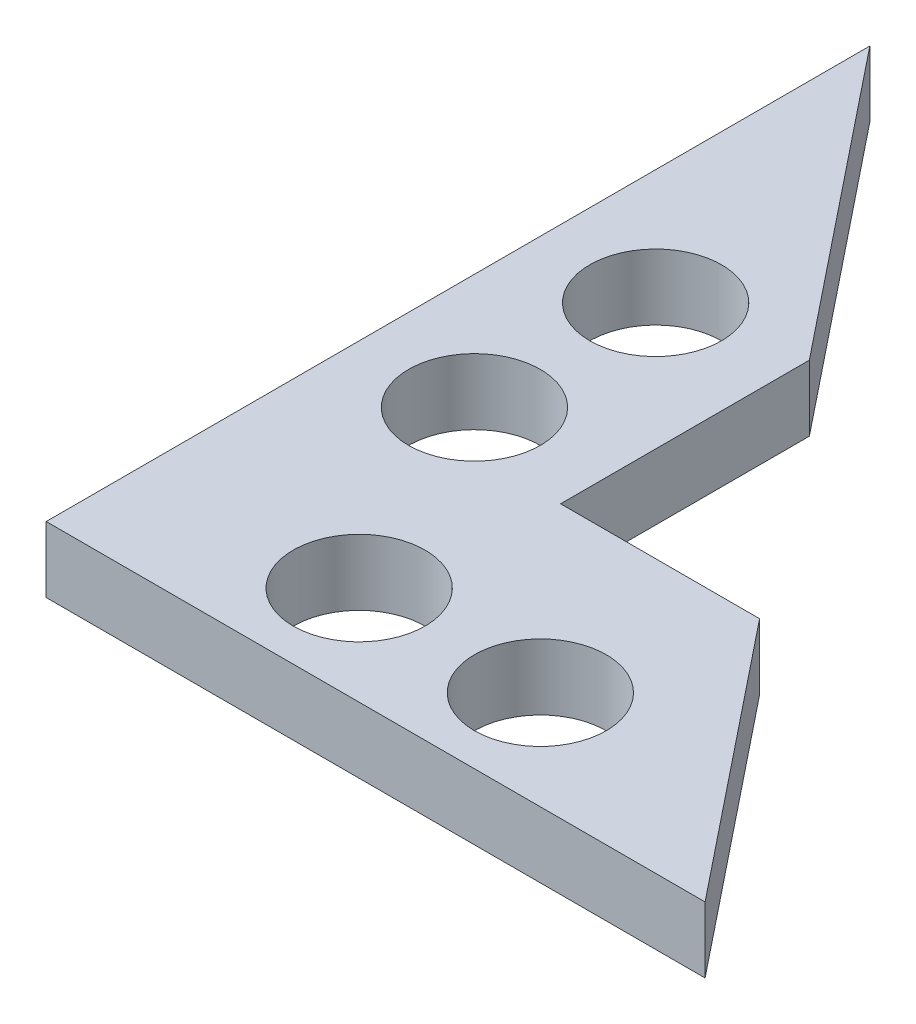
ISO-10303-21;
HEADER;
FILE_DESCRIPTION(('STEP AP214'),'2;1');
FILE_NAME('part.step','',(''),(''),'','','');
FILE_SCHEMA(('AUTOMOTIVE_DESIGN { 1 0 10303 214 1 1 1 1 }'));
ENDSEC;
DATA;
#1=APPLICATION_CONTEXT('core data for automotive mechanical design processes');
#2=APPLICATION_PROTOCOL_DEFINITION('international standard','automotive_design',2000,#1);
#3=PRODUCT_CONTEXT('',#1,'mechanical');
#4=PRODUCT('Part','Part','',(#3));
#5=PRODUCT_RELATED_PRODUCT_CATEGORY('part','',(#4));
#6=PRODUCT_DEFINITION_FORMATION('','',#4);
#7=PRODUCT_DEFINITION_CONTEXT('part definition',#1,'design');
#8=PRODUCT_DEFINITION('design','',#6,#7);
#9=PRODUCT_DEFINITION_SHAPE('','',#8);
#10=(LENGTH_UNIT() NAMED_UNIT(*) SI_UNIT(.MILLI.,.METRE.));
#11=(NAMED_UNIT(*) PLANE_ANGLE_UNIT() SI_UNIT($,.RADIAN.));
#12=(NAMED_UNIT(*) SI_UNIT($,.STERADIAN.) SOLID_ANGLE_UNIT());
#13=UNCERTAINTY_MEASURE_WITH_UNIT(LENGTH_MEASURE(1.E-05),#10,'distance_accuracy_value','');
#14=(GEOMETRIC_REPRESENTATION_CONTEXT(3) GLOBAL_UNCERTAINTY_ASSIGNED_CONTEXT((#13)) GLOBAL_UNIT_ASSIGNED_CONTEXT((#10,
#11,#12)) REPRESENTATION_CONTEXT('',''));
#15=CARTESIAN_POINT('',(0.,0.,0.));
#16=DIRECTION('',(0.,0.,1.));
#17=DIRECTION('',(1.,0.,0.));
#18=AXIS2_PLACEMENT_3D('',#15,#16,#17);
#19=CARTESIAN_POINT('',(0.,5.08,-63.5));
#20=DIRECTION('',(-0.78086880944303,0.,0.624695047554424));
#21=DIRECTION('',(0.624695047554424,0.,0.78086880944303));
#22=AXIS2_PLACEMENT_3D('',#19,#20,#21);
#23=PLANE('',#22);
#24=DIRECTION('',(-0.624695047554424,0.,-0.78086880944303));
#25=VECTOR('',#24,1.);
#26=CARTESIAN_POINT('',(0.,0.,-63.5));
#27=LINE('',#26,#25);
#28=CARTESIAN_POINT('',(50.8,0.,0.));
#29=VERTEX_POINT('',#28);
#30=CARTESIAN_POINT('',(33.9902504946271,0.,-21.0121868817161));
#31=VERTEX_POINT('',#30);
#32=EDGE_CURVE('E103',#29,#31,#27,.T.);
#33=ORIENTED_EDGE('',*,*,#32,.T.);
#34=DIRECTION('',(0.,1.,0.));
#35=VECTOR('',#34,1.);
#36=CARTESIAN_POINT('',(33.9902504946271,-2.54,-21.0121868817161));
#37=LINE('',#36,#35);
#38=CARTESIAN_POINT('',(33.9902504946271,5.08,-21.0121868817161));
#39=VERTEX_POINT('',#38);
#40=EDGE_CURVE('E98',#31,#39,#37,.T.);
#41=ORIENTED_EDGE('',*,*,#40,.T.);
#42=DIRECTION('',(-0.624695047554424,0.,-0.78086880944303));
#43=VECTOR('',#42,1.);
#44=CARTESIAN_POINT('',(0.,5.08,-63.5));
#45=LINE('',#44,#43);
#46=CARTESIAN_POINT('',(50.8,5.08,0.));
#47=VERTEX_POINT('',#46);
#48=EDGE_CURVE('E81',#47,#39,#45,.T.);
#49=ORIENTED_EDGE('',*,*,#48,.F.);
#50=DIRECTION('',(0.,-1.,0.));
#51=VECTOR('',#50,1.);
#52=CARTESIAN_POINT('',(50.8,5.08,0.));
#53=LINE('',#52,#51);
#54=EDGE_CURVE('E128',#47,#29,#53,.T.);
#55=ORIENTED_EDGE('',*,*,#54,.T.);
#56=EDGE_LOOP('',(#33,#41,#49,#55));
#57=FACE_BOUND('',#56,.T.);
#58=ADVANCED_FACE('F33',(#57),#23,.F.);
#59=CARTESIAN_POINT('',(0.,5.08,0.));
#60=DIRECTION('',(0.,0.,-1.));
#61=DIRECTION('',(-1.,0.,0.));
#62=AXIS2_PLACEMENT_3D('',#59,#60,#61);
#63=PLANE('',#62);
#64=DIRECTION('',(1.,0.,0.));
#65=VECTOR('',#64,1.);
#66=CARTESIAN_POINT('',(0.,0.,0.));
#67=LINE('',#66,#65);
#68=CARTESIAN_POINT('',(0.,0.,0.));
#69=VERTEX_POINT('',#68);
#70=EDGE_CURVE('E118',#69,#29,#67,.T.);
#71=ORIENTED_EDGE('',*,*,#70,.T.);
#72=ORIENTED_EDGE('',*,*,#54,.F.);
#73=DIRECTION('',(1.,0.,0.));
#74=VECTOR('',#73,1.);
#75=CARTESIAN_POINT('',(0.,5.08,0.));
#76=LINE('',#75,#74);
#77=CARTESIAN_POINT('',(0.,5.08,0.));
#78=VERTEX_POINT('',#77);
#79=EDGE_CURVE('E109',#78,#47,#76,.T.);
#80=ORIENTED_EDGE('',*,*,#79,.F.);
#81=DIRECTION('',(0.,-1.,0.));
#82=VECTOR('',#81,1.);
#83=CARTESIAN_POINT('',(0.,5.08,0.));
#84=LINE('',#83,#82);
#85=EDGE_CURVE('E113',#78,#69,#84,.T.);
#86=ORIENTED_EDGE('',*,*,#85,.T.);
#87=EDGE_LOOP('',(#71,#72,#80,#86));
#88=FACE_BOUND('',#87,.T.);
#89=ADVANCED_FACE('F35',(#88),#63,.F.);
#90=CARTESIAN_POINT('',(18.6461176336108,5.08,-40.1923529579865));
#91=VERTEX_POINT('',#90);
#92=CARTESIAN_POINT('',(0.,5.08,-63.5));
#93=VERTEX_POINT('',#92);
#94=EDGE_CURVE('E111',#91,#93,#45,.T.);
#95=ORIENTED_EDGE('',*,*,#94,.F.);
#96=DIRECTION('',(0.,1.,0.));
#97=VECTOR('',#96,1.);
#98=CARTESIAN_POINT('',(18.6461176336108,-2.54,-40.1923529579865));
#99=LINE('',#98,#97);
#100=CARTESIAN_POINT('',(18.6461176336108,0.,-40.1923529579865));
#101=VERTEX_POINT('',#100);
#102=EDGE_CURVE('E104',#101,#91,#99,.T.);
#103=ORIENTED_EDGE('',*,*,#102,.F.);
#104=CARTESIAN_POINT('',(0.,0.,-63.5));
#105=VERTEX_POINT('',#104);
#106=EDGE_CURVE('E121',#101,#105,#27,.T.);
#107=ORIENTED_EDGE('',*,*,#106,.T.);
#108=DIRECTION('',(0.,-1.,0.));
#109=VECTOR('',#108,1.);
#110=CARTESIAN_POINT('',(0.,5.08,-63.5));
#111=LINE('',#110,#109);
#112=EDGE_CURVE('E126',#93,#105,#111,.T.);
#113=ORIENTED_EDGE('',*,*,#112,.F.);
#114=EDGE_LOOP('',(#95,#103,#107,#113));
#115=FACE_BOUND('',#114,.T.);
#116=ADVANCED_FACE('F150',(#115),#23,.F.);
#117=CARTESIAN_POINT('',(0.,5.08,0.));
#118=DIRECTION('',(1.,0.,0.));
#119=DIRECTION('',(0.,0.,-1.));
#120=AXIS2_PLACEMENT_3D('',#117,#118,#119);
#121=PLANE('',#120);
#122=DIRECTION('',(0.,0.,1.));
#123=VECTOR('',#122,1.);
#124=CARTESIAN_POINT('',(0.,0.,0.));
#125=LINE('',#124,#123);
#126=EDGE_CURVE('E74',#105,#69,#125,.T.);
#127=ORIENTED_EDGE('',*,*,#126,.T.);
#128=ORIENTED_EDGE('',*,*,#85,.F.);
#129=DIRECTION('',(0.,0.,1.));
#130=VECTOR('',#129,1.);
#131=CARTESIAN_POINT('',(0.,5.08,0.));
#132=LINE('',#131,#130);
#133=EDGE_CURVE('E57',#93,#78,#132,.T.);
#134=ORIENTED_EDGE('',*,*,#133,.F.);
#135=ORIENTED_EDGE('',*,*,#112,.T.);
#136=EDGE_LOOP('',(#127,#128,#134,#135));
#137=FACE_BOUND('',#136,.T.);
#138=ADVANCED_FACE('F170',(#137),#121,.F.);
#139=CARTESIAN_POINT('',(0.,5.08,0.));
#140=DIRECTION('',(0.,1.,0.));
#141=DIRECTION('',(0.,0.,1.));
#142=AXIS2_PLACEMENT_3D('',#139,#140,#141);
#143=PLANE('',#142);
#144=DIRECTION('',(1.,0.,0.));
#145=VECTOR('',#144,1.);
#146=CARTESIAN_POINT('',(18.6461176336108,5.08,-21.0121868817161));
#147=LINE('',#146,#145);
#148=CARTESIAN_POINT('',(18.6461176336108,5.08,-21.0121868817161));
#149=VERTEX_POINT('',#148);
#150=EDGE_CURVE('E96',#149,#39,#147,.T.);
#151=ORIENTED_EDGE('',*,*,#150,.F.);
#152=DIRECTION('',(0.,0.,1.));
#153=VECTOR('',#152,1.);
#154=CARTESIAN_POINT('',(18.6461176336108,5.08,-21.0121868817161));
#155=LINE('',#154,#153);
#156=EDGE_CURVE('E100',#91,#149,#155,.T.);
#157=ORIENTED_EDGE('',*,*,#156,.F.);
#158=ORIENTED_EDGE('',*,*,#94,.T.);
#159=ORIENTED_EDGE('',*,*,#133,.T.);
#160=ORIENTED_EDGE('',*,*,#79,.T.);
#161=ORIENTED_EDGE('',*,*,#48,.T.);
#162=EDGE_LOOP('',(#151,#157,#158,#159,#160,#161));
#163=FACE_BOUND('',#162,.T.);
#164=CARTESIAN_POINT('',(8.89,5.08,-38.1));
#165=DIRECTION('',(0.,1.,0.));
#166=DIRECTION('',(0.,0.,1.));
#167=AXIS2_PLACEMENT_3D('',#164,#165,#166);
#168=CIRCLE('',#167,5.08);
#169=CARTESIAN_POINT('',(8.89,5.08,-33.02));
#170=VERTEX_POINT('',#169);
#171=EDGE_CURVE('E137',#170,#170,#168,.T.);
#172=ORIENTED_EDGE('',*,*,#171,.F.);
#173=EDGE_LOOP('',(#172));
#174=FACE_BOUND('',#173,.T.);
#175=CARTESIAN_POINT('',(16.51,5.08,-7.62));
#176=DIRECTION('',(0.,1.,0.));
#177=DIRECTION('',(0.,0.,1.));
#178=AXIS2_PLACEMENT_3D('',#175,#176,#177);
#179=CIRCLE('',#178,5.08);
#180=CARTESIAN_POINT('',(16.51,5.08,-2.53999999999999));
#181=VERTEX_POINT('',#180);
#182=EDGE_CURVE('E159',#181,#181,#179,.T.);
#183=ORIENTED_EDGE('',*,*,#182,.F.);
#184=EDGE_LOOP('',(#183));
#185=FACE_BOUND('',#184,.T.);
#186=CARTESIAN_POINT('',(30.48,5.08,-7.62));
#187=DIRECTION('',(0.,1.,0.));
#188=DIRECTION('',(0.,0.,1.));
#189=AXIS2_PLACEMENT_3D('',#186,#187,#188);
#190=CIRCLE('',#189,5.08);
#191=CARTESIAN_POINT('',(30.48,5.08,-2.54));
#192=VERTEX_POINT('',#191);
#193=EDGE_CURVE('E153',#192,#192,#190,.T.);
#194=ORIENTED_EDGE('',*,*,#193,.F.);
#195=EDGE_LOOP('',(#194));
#196=FACE_BOUND('',#195,.T.);
#197=CARTESIAN_POINT('',(8.89,5.08,-24.13));
#198=DIRECTION('',(0.,1.,0.));
#199=DIRECTION('',(0.,0.,1.));
#200=AXIS2_PLACEMENT_3D('',#197,#198,#199);
#201=CIRCLE('',#200,5.08);
#202=CARTESIAN_POINT('',(8.89,5.08,-19.05));
#203=VERTEX_POINT('',#202);
#204=EDGE_CURVE('E132',#203,#203,#201,.T.);
#205=ORIENTED_EDGE('',*,*,#204,.F.);
#206=EDGE_LOOP('',(#205));
#207=FACE_BOUND('',#206,.T.);
#208=ADVANCED_FACE('F106',(#163,#174,#185,#196,#207),#143,.T.);
#209=CARTESIAN_POINT('',(0.,0.,0.));
#210=DIRECTION('',(0.,1.,0.));
#211=DIRECTION('',(0.,0.,1.));
#212=AXIS2_PLACEMENT_3D('',#209,#210,#211);
#213=PLANE('',#212);
#214=CARTESIAN_POINT('',(8.89,0.,-38.1));
#215=DIRECTION('',(0.,1.,0.));
#216=DIRECTION('',(0.,0.,1.));
#217=AXIS2_PLACEMENT_3D('',#214,#215,#216);
#218=CIRCLE('',#217,5.08);
#219=CARTESIAN_POINT('',(8.89,0.,-33.02));
#220=VERTEX_POINT('',#219);
#221=EDGE_CURVE('E140',#220,#220,#218,.T.);
#222=ORIENTED_EDGE('',*,*,#221,.T.);
#223=EDGE_LOOP('',(#222));
#224=FACE_BOUND('',#223,.T.);
#225=CARTESIAN_POINT('',(16.51,0.,-7.62));
#226=DIRECTION('',(0.,1.,0.));
#227=DIRECTION('',(0.,0.,1.));
#228=AXIS2_PLACEMENT_3D('',#225,#226,#227);
#229=CIRCLE('',#228,5.08);
#230=CARTESIAN_POINT('',(16.51,0.,-2.53999999999999));
#231=VERTEX_POINT('',#230);
#232=EDGE_CURVE('E136',#231,#231,#229,.T.);
#233=ORIENTED_EDGE('',*,*,#232,.T.);
#234=EDGE_LOOP('',(#233));
#235=FACE_BOUND('',#234,.T.);
#236=CARTESIAN_POINT('',(30.48,0.,-7.62));
#237=DIRECTION('',(0.,1.,0.));
#238=DIRECTION('',(0.,0.,1.));
#239=AXIS2_PLACEMENT_3D('',#236,#237,#238);
#240=CIRCLE('',#239,5.08);
#241=CARTESIAN_POINT('',(30.48,0.,-2.54));
#242=VERTEX_POINT('',#241);
#243=EDGE_CURVE('E133',#242,#242,#240,.T.);
#244=ORIENTED_EDGE('',*,*,#243,.T.);
#245=EDGE_LOOP('',(#244));
#246=FACE_BOUND('',#245,.T.);
#247=CARTESIAN_POINT('',(8.89,0.,-24.13));
#248=DIRECTION('',(0.,1.,0.));
#249=DIRECTION('',(0.,0.,1.));
#250=AXIS2_PLACEMENT_3D('',#247,#248,#249);
#251=CIRCLE('',#250,5.08);
#252=CARTESIAN_POINT('',(8.89,0.,-19.05));
#253=VERTEX_POINT('',#252);
#254=EDGE_CURVE('E122',#253,#253,#251,.T.);
#255=ORIENTED_EDGE('',*,*,#254,.T.);
#256=EDGE_LOOP('',(#255));
#257=FACE_BOUND('',#256,.T.);
#258=DIRECTION('',(0.,0.,1.));
#259=VECTOR('',#258,1.);
#260=CARTESIAN_POINT('',(18.6461176336108,0.,0.));
#261=LINE('',#260,#259);
#262=CARTESIAN_POINT('',(18.6461176336108,0.,-21.0121868817161));
#263=VERTEX_POINT('',#262);
#264=EDGE_CURVE('E41',#101,#263,#261,.T.);
#265=ORIENTED_EDGE('',*,*,#264,.T.);
#266=DIRECTION('',(1.,0.,0.));
#267=VECTOR('',#266,1.);
#268=CARTESIAN_POINT('',(0.,0.,-21.0121868817161));
#269=LINE('',#268,#267);
#270=EDGE_CURVE('E11',#263,#31,#269,.T.);
#271=ORIENTED_EDGE('',*,*,#270,.T.);
#272=ORIENTED_EDGE('',*,*,#32,.F.);
#273=ORIENTED_EDGE('',*,*,#70,.F.);
#274=ORIENTED_EDGE('',*,*,#126,.F.);
#275=ORIENTED_EDGE('',*,*,#106,.F.);
#276=EDGE_LOOP('',(#265,#271,#272,#273,#274,#275));
#277=FACE_BOUND('',#276,.T.);
#278=ADVANCED_FACE('F145',(#224,#235,#246,#257,#277),#213,.F.);
#279=CARTESIAN_POINT('',(8.89,-2.54,-24.13));
#280=DIRECTION('',(0.,1.,0.));
#281=DIRECTION('',(0.,0.,1.));
#282=AXIS2_PLACEMENT_3D('',#279,#280,#281);
#283=CYLINDRICAL_SURFACE('',#282,5.08);
#284=ORIENTED_EDGE('',*,*,#204,.T.);
#285=EDGE_LOOP('',(#284));
#286=FACE_BOUND('',#285,.T.);
#287=ORIENTED_EDGE('',*,*,#254,.F.);
#288=EDGE_LOOP('',(#287));
#289=FACE_BOUND('',#288,.T.);
#290=ADVANCED_FACE('F166',(#286,#289),#283,.F.);
#291=CARTESIAN_POINT('',(30.48,-2.54,-7.62));
#292=DIRECTION('',(0.,1.,0.));
#293=DIRECTION('',(0.,0.,1.));
#294=AXIS2_PLACEMENT_3D('',#291,#292,#293);
#295=CYLINDRICAL_SURFACE('',#294,5.08);
#296=ORIENTED_EDGE('',*,*,#193,.T.);
#297=EDGE_LOOP('',(#296));
#298=FACE_BOUND('',#297,.T.);
#299=ORIENTED_EDGE('',*,*,#243,.F.);
#300=EDGE_LOOP('',(#299));
#301=FACE_BOUND('',#300,.T.);
#302=ADVANCED_FACE('F206',(#298,#301),#295,.F.);
#303=CARTESIAN_POINT('',(16.51,-2.54,-7.62));
#304=DIRECTION('',(0.,1.,0.));
#305=DIRECTION('',(0.,0.,1.));
#306=AXIS2_PLACEMENT_3D('',#303,#304,#305);
#307=CYLINDRICAL_SURFACE('',#306,5.08);
#308=ORIENTED_EDGE('',*,*,#182,.T.);
#309=EDGE_LOOP('',(#308));
#310=FACE_BOUND('',#309,.T.);
#311=ORIENTED_EDGE('',*,*,#232,.F.);
#312=EDGE_LOOP('',(#311));
#313=FACE_BOUND('',#312,.T.);
#314=ADVANCED_FACE('F215',(#310,#313),#307,.F.);
#315=CARTESIAN_POINT('',(8.89,-2.54,-38.1));
#316=DIRECTION('',(0.,1.,0.));
#317=DIRECTION('',(0.,0.,1.));
#318=AXIS2_PLACEMENT_3D('',#315,#316,#317);
#319=CYLINDRICAL_SURFACE('',#318,5.08);
#320=ORIENTED_EDGE('',*,*,#171,.T.);
#321=EDGE_LOOP('',(#320));
#322=FACE_BOUND('',#321,.T.);
#323=ORIENTED_EDGE('',*,*,#221,.F.);
#324=EDGE_LOOP('',(#323));
#325=FACE_BOUND('',#324,.T.);
#326=ADVANCED_FACE('F225',(#322,#325),#319,.F.);
#327=CARTESIAN_POINT('',(18.6461176336108,-2.54,-21.0121868817161));
#328=DIRECTION('',(0.,0.,1.));
#329=DIRECTION('',(1.,0.,0.));
#330=AXIS2_PLACEMENT_3D('',#327,#328,#329);
#331=PLANE('',#330);
#332=DIRECTION('',(0.,1.,0.));
#333=VECTOR('',#332,1.);
#334=CARTESIAN_POINT('',(18.6461176336108,-2.54,-21.0121868817161));
#335=LINE('',#334,#333);
#336=EDGE_CURVE('E48',#263,#149,#335,.T.);
#337=ORIENTED_EDGE('',*,*,#336,.T.);
#338=ORIENTED_EDGE('',*,*,#150,.T.);
#339=ORIENTED_EDGE('',*,*,#40,.F.);
#340=ORIENTED_EDGE('',*,*,#270,.F.);
#341=EDGE_LOOP('',(#337,#338,#339,#340));
#342=FACE_BOUND('',#341,.T.);
#343=ADVANCED_FACE('F97',(#342),#331,.F.);
#344=CARTESIAN_POINT('',(18.6461176336108,-2.54,-21.0121868817161));
#345=DIRECTION('',(-1.,0.,0.));
#346=DIRECTION('',(0.,0.,1.));
#347=AXIS2_PLACEMENT_3D('',#344,#345,#346);
#348=PLANE('',#347);
#349=ORIENTED_EDGE('',*,*,#102,.T.);
#350=ORIENTED_EDGE('',*,*,#156,.T.);
#351=ORIENTED_EDGE('',*,*,#336,.F.);
#352=ORIENTED_EDGE('',*,*,#264,.F.);
#353=EDGE_LOOP('',(#349,#350,#351,#352));
#354=FACE_BOUND('',#353,.T.);
#355=ADVANCED_FACE('F147',(#354),#348,.F.);
#356=CLOSED_SHELL('',(#58,#89,#116,#138,#208,#278,#290,#302,#314,#326,#343,#355));
#357=MANIFOLD_SOLID_BREP('B2',#356);
#358=ADVANCED_BREP_SHAPE_REPRESENTATION('',(#18,#357),#14);
#359=SHAPE_DEFINITION_REPRESENTATION(#9,#358);
ENDSEC;
END-ISO-10303-21;
